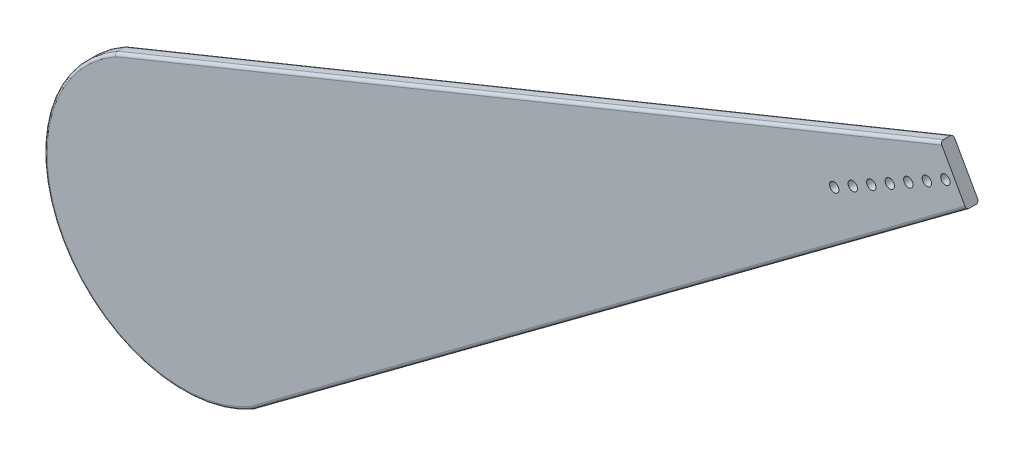
ISO-10303-21;
HEADER;
FILE_DESCRIPTION(('STEP AP214'),'2;1');
FILE_NAME('part.step','',(''),(''),'','','');
FILE_SCHEMA(('AUTOMOTIVE_DESIGN { 1 0 10303 214 1 1 1 1 }'));
ENDSEC;
DATA;
#1=APPLICATION_CONTEXT('core data for automotive mechanical design processes');
#2=APPLICATION_PROTOCOL_DEFINITION('international standard','automotive_design',2000,#1);
#3=PRODUCT_CONTEXT('',#1,'mechanical');
#4=PRODUCT('Part','Part','',(#3));
#5=PRODUCT_RELATED_PRODUCT_CATEGORY('part','',(#4));
#6=PRODUCT_DEFINITION_FORMATION('','',#4);
#7=PRODUCT_DEFINITION_CONTEXT('part definition',#1,'design');
#8=PRODUCT_DEFINITION('design','',#6,#7);
#9=PRODUCT_DEFINITION_SHAPE('','',#8);
#10=(LENGTH_UNIT() NAMED_UNIT(*) SI_UNIT(.MILLI.,.METRE.));
#11=(NAMED_UNIT(*) PLANE_ANGLE_UNIT() SI_UNIT($,.RADIAN.));
#12=(NAMED_UNIT(*) SI_UNIT($,.STERADIAN.) SOLID_ANGLE_UNIT());
#13=UNCERTAINTY_MEASURE_WITH_UNIT(LENGTH_MEASURE(1.E-05),#10,'distance_accuracy_value','');
#14=(GEOMETRIC_REPRESENTATION_CONTEXT(3) GLOBAL_UNCERTAINTY_ASSIGNED_CONTEXT((#13)) GLOBAL_UNIT_ASSIGNED_CONTEXT((#10,
#11,#12)) REPRESENTATION_CONTEXT('',''));
#15=CARTESIAN_POINT('',(0.,0.,0.));
#16=DIRECTION('',(0.,0.,1.));
#17=DIRECTION('',(1.,0.,0.));
#18=AXIS2_PLACEMENT_3D('',#15,#16,#17);
#19=CARTESIAN_POINT('',(-4.99999999999996,3.66025403784442,3.));
#20=DIRECTION('',(0.377162887212808,-0.926146941100222,0.));
#21=DIRECTION('',(0.926146941100222,0.377162887212808,0.));
#22=AXIS2_PLACEMENT_3D('',#19,#20,#21);
#23=PLANE('',#22);
#24=DIRECTION('',(-0.926146941100222,-0.377162887212808,0.));
#25=VECTOR('',#24,1.);
#26=CARTESIAN_POINT('',(-4.99999999999996,3.66025403784442,2.3));
#27=LINE('',#26,#25);
#28=CARTESIAN_POINT('',(-208.752327042049,-79.3155811489734,2.3));
#29=VERTEX_POINT('',#28);
#30=CARTESIAN_POINT('',(-14.2634471787925,-0.112180257890787,2.3));
#31=VERTEX_POINT('',#30);
#32=EDGE_CURVE('E136',#29,#31,#27,.F.);
#33=ORIENTED_EDGE('',*,*,#32,.T.);
#34=DIRECTION('',(0.,0.,-1.));
#35=VECTOR('',#34,1.);
#36=CARTESIAN_POINT('',(-14.2634471787925,-0.112180257890787,3.));
#37=LINE('',#36,#35);
#38=CARTESIAN_POINT('',(-14.2634471787925,-0.112180257890787,0.7));
#39=VERTEX_POINT('',#38);
#40=EDGE_CURVE('E113',#31,#39,#37,.T.);
#41=ORIENTED_EDGE('',*,*,#40,.T.);
#42=DIRECTION('',(-0.926146941100222,-0.377162887212808,0.));
#43=VECTOR('',#42,1.);
#44=CARTESIAN_POINT('',(-4.99999999999996,3.66025403784442,0.7));
#45=LINE('',#44,#43);
#46=CARTESIAN_POINT('',(-208.752327042049,-79.3155811489734,0.7));
#47=VERTEX_POINT('',#46);
#48=EDGE_CURVE('E131',#39,#47,#45,.T.);
#49=ORIENTED_EDGE('',*,*,#48,.T.);
#50=DIRECTION('',(0.,0.,-1.));
#51=VECTOR('',#50,1.);
#52=CARTESIAN_POINT('',(-208.752327042049,-79.3155811489734,3.));
#53=LINE('',#52,#51);
#54=EDGE_CURVE('E221',#29,#47,#53,.T.);
#55=ORIENTED_EDGE('',*,*,#54,.F.);
#56=EDGE_LOOP('',(#33,#41,#49,#55));
#57=FACE_BOUND('',#56,.T.);
#58=ADVANCED_FACE('F45',(#57),#23,.F.);
#59=CARTESIAN_POINT('',(-192.684144602412,-107.745140553955,3.));
#60=DIRECTION('',(0.,0.,-1.));
#61=DIRECTION('',(-1.,0.,0.));
#62=AXIS2_PLACEMENT_3D('',#59,#60,#61);
#63=CYLINDRICAL_SURFACE('',#62,32.6561837157195);
#64=ORIENTED_EDGE('',*,*,#54,.T.);
#65=CARTESIAN_POINT('',(-192.684144602412,-107.745140553955,0.7));
#66=DIRECTION('',(0.,0.,1.));
#67=DIRECTION('',(1.,0.,0.));
#68=AXIS2_PLACEMENT_3D('',#65,#66,#67);
#69=CIRCLE('',#68,32.6561837157195);
#70=CARTESIAN_POINT('',(-176.615962162776,-136.174699958937,0.7));
#71=VERTEX_POINT('',#70);
#72=EDGE_CURVE('E215',#47,#71,#69,.T.);
#73=ORIENTED_EDGE('',*,*,#72,.T.);
#74=DIRECTION('',(0.,0.,-1.));
#75=VECTOR('',#74,1.);
#76=CARTESIAN_POINT('',(-176.615962162776,-136.174699958937,3.));
#77=LINE('',#76,#75);
#78=CARTESIAN_POINT('',(-176.615962162776,-136.174699958937,2.3));
#79=VERTEX_POINT('',#78);
#80=EDGE_CURVE('E225',#79,#71,#77,.T.);
#81=ORIENTED_EDGE('',*,*,#80,.F.);
#82=CARTESIAN_POINT('',(-192.684144602412,-107.745140553955,2.3));
#83=DIRECTION('',(0.,0.,1.));
#84=DIRECTION('',(1.,0.,0.));
#85=AXIS2_PLACEMENT_3D('',#82,#83,#84);
#86=CIRCLE('',#85,32.6561837157195);
#87=EDGE_CURVE('E199',#79,#29,#86,.F.);
#88=ORIENTED_EDGE('',*,*,#87,.T.);
#89=EDGE_LOOP('',(#64,#73,#81,#88));
#90=FACE_BOUND('',#89,.T.);
#91=ADVANCED_FACE('F320',(#90),#63,.T.);
#92=CARTESIAN_POINT('',(0.,-5.,3.));
#93=DIRECTION('',(-0.596248636176985,0.802799828012616,0.));
#94=DIRECTION('',(-0.802799828012616,-0.596248636176985,0.));
#95=AXIS2_PLACEMENT_3D('',#92,#93,#94);
#96=PLANE('',#95);
#97=DIRECTION('',(0.802799828012616,0.596248636176985,0.));
#98=VECTOR('',#97,1.);
#99=CARTESIAN_POINT('',(0.,-5.,0.7));
#100=LINE('',#99,#98);
#101=CARTESIAN_POINT('',(-8.1408503695447,-11.0463029024038,0.7));
#102=VERTEX_POINT('',#101);
#103=EDGE_CURVE('E55',#71,#102,#100,.T.);
#104=ORIENTED_EDGE('',*,*,#103,.T.);
#105=DIRECTION('',(0.,0.,1.));
#106=VECTOR('',#105,1.);
#107=CARTESIAN_POINT('',(-8.1408503695447,-11.0463029024038,3.));
#108=LINE('',#107,#106);
#109=CARTESIAN_POINT('',(-8.1408503695447,-11.0463029024038,2.3));
#110=VERTEX_POINT('',#109);
#111=EDGE_CURVE('E126',#102,#110,#108,.T.);
#112=ORIENTED_EDGE('',*,*,#111,.T.);
#113=DIRECTION('',(0.802799828012616,0.596248636176985,0.));
#114=VECTOR('',#113,1.);
#115=CARTESIAN_POINT('',(-176.615962162776,-136.174699958937,2.3));
#116=LINE('',#115,#114);
#117=EDGE_CURVE('E143',#110,#79,#116,.F.);
#118=ORIENTED_EDGE('',*,*,#117,.T.);
#119=ORIENTED_EDGE('',*,*,#80,.T.);
#120=EDGE_LOOP('',(#104,#112,#118,#119));
#121=FACE_BOUND('',#120,.T.);
#122=ADVANCED_FACE('F300',(#121),#96,.F.);
#123=CARTESIAN_POINT('',(0.,-5.,3.));
#124=DIRECTION('',(0.,0.,1.));
#125=DIRECTION('',(1.,0.,0.));
#126=AXIS2_PLACEMENT_3D('',#123,#124,#125);
#127=PLANE('',#126);
#128=DIRECTION('',(0.488572273581651,-0.872523428617969,0.));
#129=VECTOR('',#128,1.);
#130=CARTESIAN_POINT('',(-10.9065428577246,-6.10715341977064,3.));
#131=LINE('',#130,#129);
#132=CARTESIAN_POINT('',(-13.9188122786738,-0.727651173725995,3.));
#133=VERTEX_POINT('',#132);
#134=CARTESIAN_POINT('',(-8.48568821434414,-10.4304695550549,3.));
#135=VERTEX_POINT('',#134);
#136=EDGE_CURVE('E61',#133,#135,#131,.T.);
#137=ORIENTED_EDGE('',*,*,#136,.F.);
#138=DIRECTION('',(-0.926146941100222,-0.377162887212808,0.));
#139=VECTOR('',#138,1.);
#140=CARTESIAN_POINT('',(-208.488313021,-79.9638840077436,3.));
#141=LINE('',#140,#139);
#142=CARTESIAN_POINT('',(-208.446636530336,-79.9469117273742,3.));
#143=VERTEX_POINT('',#142);
#144=EDGE_CURVE('E68',#133,#143,#141,.T.);
#145=ORIENTED_EDGE('',*,*,#144,.T.);
#146=CARTESIAN_POINT('',(-192.684144602412,-107.745140553955,3.));
#147=DIRECTION('',(0.,0.,1.));
#148=DIRECTION('',(1.,0.,0.));
#149=AXIS2_PLACEMENT_3D('',#146,#147,#148);
#150=CIRCLE('',#149,31.9561837157195);
#151=CARTESIAN_POINT('',(-176.998150387385,-135.586607166886,3.));
#152=VERTEX_POINT('',#151);
#153=EDGE_CURVE('E132',#143,#152,#150,.T.);
#154=ORIENTED_EDGE('',*,*,#153,.T.);
#155=DIRECTION('',(0.802799828012616,0.596248636176985,0.));
#156=VECTOR('',#155,1.);
#157=CARTESIAN_POINT('',(-0.417374045323888,-4.43804012039117,3.));
#158=LINE('',#157,#156);
#159=EDGE_CURVE('E124',#152,#135,#158,.T.);
#160=ORIENTED_EDGE('',*,*,#159,.T.);
#161=EDGE_LOOP('',(#137,#145,#154,#160));
#162=FACE_BOUND('',#161,.T.);
#163=CARTESIAN_POINT('',(-39.2635542878086,-21.9857523111743,3.));
#164=DIRECTION('',(0.,0.,1.));
#165=DIRECTION('',(1.,0.,0.));
#166=AXIS2_PLACEMENT_3D('',#163,#164,#165);
#167=CIRCLE('',#166,1.09999999999999);
#168=CARTESIAN_POINT('',(-38.1635542878086,-21.9857523111743,3.));
#169=VERTEX_POINT('',#168);
#170=EDGE_CURVE('E281',#169,#169,#167,.T.);
#171=ORIENTED_EDGE('',*,*,#170,.F.);
#172=EDGE_LOOP('',(#171));
#173=FACE_BOUND('',#172,.T.);
#174=CARTESIAN_POINT('',(-34.9009371447188,-19.542890943266,3.));
#175=DIRECTION('',(0.,0.,1.));
#176=DIRECTION('',(1.,0.,0.));
#177=AXIS2_PLACEMENT_3D('',#174,#175,#176);
#178=CIRCLE('',#177,1.09999999999999);
#179=CARTESIAN_POINT('',(-33.8009371447188,-19.542890943266,3.));
#180=VERTEX_POINT('',#179);
#181=EDGE_CURVE('E273',#180,#180,#178,.T.);
#182=ORIENTED_EDGE('',*,*,#181,.F.);
#183=EDGE_LOOP('',(#182));
#184=FACE_BOUND('',#183,.T.);
#185=CARTESIAN_POINT('',(-30.5383200016289,-17.1000295753578,3.));
#186=DIRECTION('',(0.,0.,1.));
#187=DIRECTION('',(1.,0.,0.));
#188=AXIS2_PLACEMENT_3D('',#185,#186,#187);
#189=CIRCLE('',#188,1.09999999999999);
#190=CARTESIAN_POINT('',(-29.4383200016289,-17.1000295753578,3.));
#191=VERTEX_POINT('',#190);
#192=EDGE_CURVE('E265',#191,#191,#189,.T.);
#193=ORIENTED_EDGE('',*,*,#192,.F.);
#194=EDGE_LOOP('',(#193));
#195=FACE_BOUND('',#194,.T.);
#196=CARTESIAN_POINT('',(-26.1757028585391,-14.6571682074495,3.));
#197=DIRECTION('',(0.,0.,1.));
#198=DIRECTION('',(1.,0.,0.));
#199=AXIS2_PLACEMENT_3D('',#196,#197,#198);
#200=CIRCLE('',#199,1.09999999999999);
#201=CARTESIAN_POINT('',(-25.0757028585391,-14.6571682074495,3.));
#202=VERTEX_POINT('',#201);
#203=EDGE_CURVE('E257',#202,#202,#200,.T.);
#204=ORIENTED_EDGE('',*,*,#203,.F.);
#205=EDGE_LOOP('',(#204));
#206=FACE_BOUND('',#205,.T.);
#207=CARTESIAN_POINT('',(-21.8130857154492,-12.2143068395413,3.));
#208=DIRECTION('',(0.,0.,1.));
#209=DIRECTION('',(1.,0.,0.));
#210=AXIS2_PLACEMENT_3D('',#207,#208,#209);
#211=CIRCLE('',#210,1.09999999999999);
#212=CARTESIAN_POINT('',(-20.7130857154492,-12.2143068395413,3.));
#213=VERTEX_POINT('',#212);
#214=EDGE_CURVE('E249',#213,#213,#211,.T.);
#215=ORIENTED_EDGE('',*,*,#214,.F.);
#216=EDGE_LOOP('',(#215));
#217=FACE_BOUND('',#216,.T.);
#218=CARTESIAN_POINT('',(-17.4504685723594,-9.77144547163302,3.));
#219=DIRECTION('',(0.,0.,1.));
#220=DIRECTION('',(1.,0.,0.));
#221=AXIS2_PLACEMENT_3D('',#218,#219,#220);
#222=CIRCLE('',#221,1.09999999999999);
#223=CARTESIAN_POINT('',(-16.3504685723594,-9.77144547163302,3.));
#224=VERTEX_POINT('',#223);
#225=EDGE_CURVE('E241',#224,#224,#222,.T.);
#226=ORIENTED_EDGE('',*,*,#225,.F.);
#227=EDGE_LOOP('',(#226));
#228=FACE_BOUND('',#227,.T.);
#229=CARTESIAN_POINT('',(-13.0878514292695,-7.32858410372477,3.));
#230=DIRECTION('',(0.,0.,1.));
#231=DIRECTION('',(1.,0.,0.));
#232=AXIS2_PLACEMENT_3D('',#229,#230,#231);
#233=CIRCLE('',#232,1.09999999999999);
#234=CARTESIAN_POINT('',(-11.9878514292695,-7.32858410372477,3.));
#235=VERTEX_POINT('',#234);
#236=EDGE_CURVE('E233',#235,#235,#233,.T.);
#237=ORIENTED_EDGE('',*,*,#236,.F.);
#238=EDGE_LOOP('',(#237));
#239=FACE_BOUND('',#238,.T.);
#240=ADVANCED_FACE('F121',(#162,#173,#184,#195,#206,#217,#228,#239),#127,.T.);
#241=CARTESIAN_POINT('',(0.,-5.,0.));
#242=DIRECTION('',(0.,0.,1.));
#243=DIRECTION('',(1.,0.,0.));
#244=AXIS2_PLACEMENT_3D('',#241,#242,#243);
#245=PLANE('',#244);
#246=DIRECTION('',(-0.926146941100222,-0.377162887212808,0.));
#247=VECTOR('',#246,1.);
#248=CARTESIAN_POINT('',(-3.47234341606038,3.52655534853645,0.));
#249=LINE('',#248,#247);
#250=CARTESIAN_POINT('',(-208.446636530336,-79.9469117273741,0.));
#251=VERTEX_POINT('',#250);
#252=CARTESIAN_POINT('',(-13.9188122786738,-0.727651173725995,0.));
#253=VERTEX_POINT('',#252);
#254=EDGE_CURVE('E203',#251,#253,#249,.F.);
#255=ORIENTED_EDGE('',*,*,#254,.T.);
#256=DIRECTION('',(0.488572273581651,-0.872523428617969,0.));
#257=VECTOR('',#256,1.);
#258=CARTESIAN_POINT('',(-8.77508908135892,-9.91363908720692,0.));
#259=LINE('',#258,#257);
#260=CARTESIAN_POINT('',(-8.48568821434414,-10.4304695550549,0.));
#261=VERTEX_POINT('',#260);
#262=EDGE_CURVE('E290',#253,#261,#259,.T.);
#263=ORIENTED_EDGE('',*,*,#262,.T.);
#264=DIRECTION('',(0.802799828012616,0.596248636176985,0.));
#265=VECTOR('',#264,1.);
#266=CARTESIAN_POINT('',(-0.417374045323892,-4.43804012039117,0.));
#267=LINE('',#266,#265);
#268=CARTESIAN_POINT('',(-176.998150387385,-135.586607166886,0.));
#269=VERTEX_POINT('',#268);
#270=EDGE_CURVE('E212',#261,#269,#267,.F.);
#271=ORIENTED_EDGE('',*,*,#270,.T.);
#272=CARTESIAN_POINT('',(-192.684144602412,-107.745140553955,0.));
#273=DIRECTION('',(0.,0.,1.));
#274=DIRECTION('',(1.,0.,0.));
#275=AXIS2_PLACEMENT_3D('',#272,#273,#274);
#276=CIRCLE('',#275,31.9561837157195);
#277=EDGE_CURVE('E206',#269,#251,#276,.F.);
#278=ORIENTED_EDGE('',*,*,#277,.T.);
#279=EDGE_LOOP('',(#255,#263,#271,#278));
#280=FACE_BOUND('',#279,.T.);
#281=CARTESIAN_POINT('',(-39.2635542878086,-21.9857523111743,0.));
#282=DIRECTION('',(0.,0.,1.));
#283=DIRECTION('',(1.,0.,0.));
#284=AXIS2_PLACEMENT_3D('',#281,#282,#283);
#285=CIRCLE('',#284,1.09999999999999);
#286=CARTESIAN_POINT('',(-38.1635542878086,-21.9857523111743,0.));
#287=VERTEX_POINT('',#286);
#288=EDGE_CURVE('E277',#287,#287,#285,.T.);
#289=ORIENTED_EDGE('',*,*,#288,.T.);
#290=EDGE_LOOP('',(#289));
#291=FACE_BOUND('',#290,.T.);
#292=CARTESIAN_POINT('',(-34.9009371447188,-19.542890943266,0.));
#293=DIRECTION('',(0.,0.,1.));
#294=DIRECTION('',(1.,0.,0.));
#295=AXIS2_PLACEMENT_3D('',#292,#293,#294);
#296=CIRCLE('',#295,1.09999999999999);
#297=CARTESIAN_POINT('',(-33.8009371447188,-19.542890943266,0.));
#298=VERTEX_POINT('',#297);
#299=EDGE_CURVE('E269',#298,#298,#296,.T.);
#300=ORIENTED_EDGE('',*,*,#299,.T.);
#301=EDGE_LOOP('',(#300));
#302=FACE_BOUND('',#301,.T.);
#303=CARTESIAN_POINT('',(-30.5383200016289,-17.1000295753578,0.));
#304=DIRECTION('',(0.,0.,1.));
#305=DIRECTION('',(1.,0.,0.));
#306=AXIS2_PLACEMENT_3D('',#303,#304,#305);
#307=CIRCLE('',#306,1.09999999999999);
#308=CARTESIAN_POINT('',(-29.4383200016289,-17.1000295753578,0.));
#309=VERTEX_POINT('',#308);
#310=EDGE_CURVE('E261',#309,#309,#307,.T.);
#311=ORIENTED_EDGE('',*,*,#310,.T.);
#312=EDGE_LOOP('',(#311));
#313=FACE_BOUND('',#312,.T.);
#314=CARTESIAN_POINT('',(-26.1757028585391,-14.6571682074495,0.));
#315=DIRECTION('',(0.,0.,1.));
#316=DIRECTION('',(1.,0.,0.));
#317=AXIS2_PLACEMENT_3D('',#314,#315,#316);
#318=CIRCLE('',#317,1.09999999999999);
#319=CARTESIAN_POINT('',(-25.0757028585391,-14.6571682074495,0.));
#320=VERTEX_POINT('',#319);
#321=EDGE_CURVE('E253',#320,#320,#318,.T.);
#322=ORIENTED_EDGE('',*,*,#321,.T.);
#323=EDGE_LOOP('',(#322));
#324=FACE_BOUND('',#323,.T.);
#325=CARTESIAN_POINT('',(-21.8130857154492,-12.2143068395413,0.));
#326=DIRECTION('',(0.,0.,1.));
#327=DIRECTION('',(1.,0.,0.));
#328=AXIS2_PLACEMENT_3D('',#325,#326,#327);
#329=CIRCLE('',#328,1.09999999999999);
#330=CARTESIAN_POINT('',(-20.7130857154492,-12.2143068395413,0.));
#331=VERTEX_POINT('',#330);
#332=EDGE_CURVE('E245',#331,#331,#329,.T.);
#333=ORIENTED_EDGE('',*,*,#332,.T.);
#334=EDGE_LOOP('',(#333));
#335=FACE_BOUND('',#334,.T.);
#336=CARTESIAN_POINT('',(-17.4504685723594,-9.77144547163302,0.));
#337=DIRECTION('',(0.,0.,1.));
#338=DIRECTION('',(1.,0.,0.));
#339=AXIS2_PLACEMENT_3D('',#336,#337,#338);
#340=CIRCLE('',#339,1.09999999999999);
#341=CARTESIAN_POINT('',(-16.3504685723594,-9.77144547163302,0.));
#342=VERTEX_POINT('',#341);
#343=EDGE_CURVE('E237',#342,#342,#340,.T.);
#344=ORIENTED_EDGE('',*,*,#343,.T.);
#345=EDGE_LOOP('',(#344));
#346=FACE_BOUND('',#345,.T.);
#347=CARTESIAN_POINT('',(-13.0878514292695,-7.32858410372477,0.));
#348=DIRECTION('',(0.,0.,1.));
#349=DIRECTION('',(1.,0.,0.));
#350=AXIS2_PLACEMENT_3D('',#347,#348,#349);
#351=CIRCLE('',#350,1.09999999999999);
#352=CARTESIAN_POINT('',(-11.9878514292695,-7.32858410372477,0.));
#353=VERTEX_POINT('',#352);
#354=EDGE_CURVE('E229',#353,#353,#351,.T.);
#355=ORIENTED_EDGE('',*,*,#354,.T.);
#356=EDGE_LOOP('',(#355));
#357=FACE_BOUND('',#356,.T.);
#358=ADVANCED_FACE('F309',(#280,#291,#302,#313,#324,#335,#346,#357),#245,.F.);
#359=CARTESIAN_POINT('',(-13.0878514292695,-7.32858410372477,3.));
#360=DIRECTION('',(0.,0.,1.));
#361=DIRECTION('',(1.,0.,0.));
#362=AXIS2_PLACEMENT_3D('',#359,#360,#361);
#363=CYLINDRICAL_SURFACE('',#362,1.09999999999999);
#364=ORIENTED_EDGE('',*,*,#354,.F.);
#365=EDGE_LOOP('',(#364));
#366=FACE_BOUND('',#365,.T.);
#367=ORIENTED_EDGE('',*,*,#236,.T.);
#368=EDGE_LOOP('',(#367));
#369=FACE_BOUND('',#368,.T.);
#370=ADVANCED_FACE('F332',(#366,#369),#363,.F.);
#371=CARTESIAN_POINT('',(-17.4504685723594,-9.77144547163302,3.));
#372=DIRECTION('',(0.,0.,1.));
#373=DIRECTION('',(1.,0.,0.));
#374=AXIS2_PLACEMENT_3D('',#371,#372,#373);
#375=CYLINDRICAL_SURFACE('',#374,1.09999999999999);
#376=ORIENTED_EDGE('',*,*,#343,.F.);
#377=EDGE_LOOP('',(#376));
#378=FACE_BOUND('',#377,.T.);
#379=ORIENTED_EDGE('',*,*,#225,.T.);
#380=EDGE_LOOP('',(#379));
#381=FACE_BOUND('',#380,.T.);
#382=ADVANCED_FACE('F337',(#378,#381),#375,.F.);
#383=CARTESIAN_POINT('',(-21.8130857154492,-12.2143068395413,3.));
#384=DIRECTION('',(0.,0.,1.));
#385=DIRECTION('',(1.,0.,0.));
#386=AXIS2_PLACEMENT_3D('',#383,#384,#385);
#387=CYLINDRICAL_SURFACE('',#386,1.09999999999999);
#388=ORIENTED_EDGE('',*,*,#332,.F.);
#389=EDGE_LOOP('',(#388));
#390=FACE_BOUND('',#389,.T.);
#391=ORIENTED_EDGE('',*,*,#214,.T.);
#392=EDGE_LOOP('',(#391));
#393=FACE_BOUND('',#392,.T.);
#394=ADVANCED_FACE('F341',(#390,#393),#387,.F.);
#395=CARTESIAN_POINT('',(-26.1757028585391,-14.6571682074495,3.));
#396=DIRECTION('',(0.,0.,1.));
#397=DIRECTION('',(1.,0.,0.));
#398=AXIS2_PLACEMENT_3D('',#395,#396,#397);
#399=CYLINDRICAL_SURFACE('',#398,1.09999999999999);
#400=ORIENTED_EDGE('',*,*,#321,.F.);
#401=EDGE_LOOP('',(#400));
#402=FACE_BOUND('',#401,.T.);
#403=ORIENTED_EDGE('',*,*,#203,.T.);
#404=EDGE_LOOP('',(#403));
#405=FACE_BOUND('',#404,.T.);
#406=ADVANCED_FACE('F345',(#402,#405),#399,.F.);
#407=CARTESIAN_POINT('',(-30.5383200016289,-17.1000295753578,3.));
#408=DIRECTION('',(0.,0.,1.));
#409=DIRECTION('',(1.,0.,0.));
#410=AXIS2_PLACEMENT_3D('',#407,#408,#409);
#411=CYLINDRICAL_SURFACE('',#410,1.09999999999999);
#412=ORIENTED_EDGE('',*,*,#310,.F.);
#413=EDGE_LOOP('',(#412));
#414=FACE_BOUND('',#413,.T.);
#415=ORIENTED_EDGE('',*,*,#192,.T.);
#416=EDGE_LOOP('',(#415));
#417=FACE_BOUND('',#416,.T.);
#418=ADVANCED_FACE('F349',(#414,#417),#411,.F.);
#419=CARTESIAN_POINT('',(-34.9009371447188,-19.542890943266,3.));
#420=DIRECTION('',(0.,0.,1.));
#421=DIRECTION('',(1.,0.,0.));
#422=AXIS2_PLACEMENT_3D('',#419,#420,#421);
#423=CYLINDRICAL_SURFACE('',#422,1.09999999999999);
#424=ORIENTED_EDGE('',*,*,#299,.F.);
#425=EDGE_LOOP('',(#424));
#426=FACE_BOUND('',#425,.T.);
#427=ORIENTED_EDGE('',*,*,#181,.T.);
#428=EDGE_LOOP('',(#427));
#429=FACE_BOUND('',#428,.T.);
#430=ADVANCED_FACE('F353',(#426,#429),#423,.F.);
#431=CARTESIAN_POINT('',(-39.2635542878086,-21.9857523111743,3.));
#432=DIRECTION('',(0.,0.,1.));
#433=DIRECTION('',(1.,0.,0.));
#434=AXIS2_PLACEMENT_3D('',#431,#432,#433);
#435=CYLINDRICAL_SURFACE('',#434,1.09999999999999);
#436=ORIENTED_EDGE('',*,*,#288,.F.);
#437=EDGE_LOOP('',(#436));
#438=FACE_BOUND('',#437,.T.);
#439=ORIENTED_EDGE('',*,*,#170,.T.);
#440=EDGE_LOOP('',(#439));
#441=FACE_BOUND('',#440,.T.);
#442=ADVANCED_FACE('F177',(#438,#441),#435,.F.);
#443=CARTESIAN_POINT('',(-4.73598597895099,3.01195117907427,0.7));
#444=DIRECTION('',(-0.926146941100222,-0.377162887212808,0.));
#445=DIRECTION('',(0.377162887212808,-0.926146941100222,0.));
#446=AXIS2_PLACEMENT_3D('',#443,#444,#445);
#447=CYLINDRICAL_SURFACE('',#446,0.7);
#448=CARTESIAN_POINT('',(-13.9188122786738,-0.727651173725994,0.7));
#449=DIRECTION('',(-0.872523428617969,-0.488572273581651,0.));
#450=DIRECTION('',(-0.488572273581651,0.872523428617969,0.));
#451=AXIS2_PLACEMENT_3D('',#448,#449,#450);
#452=ELLIPSE('',#451,0.70539185040576,0.7);
#453=EDGE_CURVE('E287',#253,#39,#452,.F.);
#454=ORIENTED_EDGE('',*,*,#453,.F.);
#455=ORIENTED_EDGE('',*,*,#254,.F.);
#456=CARTESIAN_POINT('',(-208.752327042049,-79.3155811489734,0.7));
#457=CARTESIAN_POINT('',(-208.752341695203,-79.3155507111608,0.660678877179086));
#458=CARTESIAN_POINT('',(-208.750882127115,-79.3185679094294,0.621368212379049));
#459=CARTESIAN_POINT('',(-208.74512271286,-79.3304728957017,0.543889348580937));
#460=CARTESIAN_POINT('',(-208.740825064485,-79.339356141076,0.505720289419379));
#461=CARTESIAN_POINT('',(-208.729494752189,-79.3627745401859,0.431564997581965));
#462=CARTESIAN_POINT('',(-208.722460835942,-79.3773122818514,0.395579773126294));
#463=CARTESIAN_POINT('',(-208.705865302617,-79.4116091677911,0.326835738624374));
#464=CARTESIAN_POINT('',(-208.696304251495,-79.4313671429838,0.294076208429613));
#465=CARTESIAN_POINT('',(-208.674915575979,-79.4755624314384,0.232672607995611));
#466=CARTESIAN_POINT('',(-208.663086053654,-79.5000036629608,0.204032019256086));
#467=CARTESIAN_POINT('',(-208.637496600431,-79.552868220131,0.151695176662847));
#468=CARTESIAN_POINT('',(-208.623735985963,-79.5812929558603,0.128000681054236));
#469=CARTESIAN_POINT('',(-208.594647014183,-79.6413727802425,0.0861867785621484));
#470=CARTESIAN_POINT('',(-208.57931522779,-79.6730349342053,0.0680799274046772));
#471=CARTESIAN_POINT('',(-208.547549106089,-79.7386266179619,0.0380327804928994));
#472=CARTESIAN_POINT('',(-208.531115810769,-79.7725540089199,0.0260867581430442));
#473=CARTESIAN_POINT('',(-208.504310237496,-79.827887157878,0.0121484793841041));
#474=CARTESIAN_POINT('',(-208.494134112068,-79.8488912776816,0.0080865911750149));
#475=CARTESIAN_POINT('',(-208.473663272037,-79.8911404438025,0.00233952327914135));
#476=CARTESIAN_POINT('',(-208.463368753029,-79.9123850920385,0.000650870085869237));
#477=CARTESIAN_POINT('',(-208.450924391831,-79.9380639916437,5.14668721393049E-05));
#478=CARTESIAN_POINT('',(-208.448780318648,-79.9424881957286,-1.38091442617454E-07));
#479=CARTESIAN_POINT('',(-208.446636530336,-79.9469117273747,0.));
#480=B_SPLINE_CURVE_WITH_KNOTS('',3,(#456,#457,#458,#459,#460,#461,#462,#463,#464,#465,#466,
#467,#468,#469,#470,#471,#472,#473,#474,#475,#476,#477,#478,#479),.UNSPECIFIED.,.F.,.F.,(4,2,2,
2,2,2,2,2,2,2,2,4),(0.,0.117805709317535,0.235520297460631,0.353288824317571,0.471030999004601,
0.588872116593268,0.706755053460866,0.824900982325654,0.942936893697377,1.01390492030328,
1.08476896835987,1.09951761831528),.UNSPECIFIED.);
#481=EDGE_CURVE('E158',#47,#251,#480,.T.);
#482=ORIENTED_EDGE('',*,*,#481,.F.);
#483=ORIENTED_EDGE('',*,*,#48,.F.);
#484=EDGE_LOOP('',(#454,#455,#482,#483));
#485=FACE_BOUND('',#484,.T.);
#486=ADVANCED_FACE('F172',(#485),#447,.T.);
#487=CARTESIAN_POINT('',(-0.417374045323888,-4.43804012039117,0.7));
#488=DIRECTION('',(0.802799828012616,0.596248636176985,0.));
#489=DIRECTION('',(-0.596248636176985,0.802799828012616,0.));
#490=AXIS2_PLACEMENT_3D('',#487,#488,#489);
#491=CYLINDRICAL_SURFACE('',#490,0.7);
#492=CARTESIAN_POINT('',(-8.48568821434414,-10.4304695550549,0.7));
#493=DIRECTION('',(-0.872523428617969,-0.488572273581651,0.));
#494=DIRECTION('',(-0.488572273581651,0.872523428617969,0.));
#495=AXIS2_PLACEMENT_3D('',#492,#493,#494);
#496=ELLIPSE('',#495,0.705807233536793,0.7);
#497=EDGE_CURVE('E294',#102,#261,#496,.F.);
#498=ORIENTED_EDGE('',*,*,#497,.F.);
#499=ORIENTED_EDGE('',*,*,#103,.F.);
#500=CARTESIAN_POINT('',(-176.615962162776,-136.174699958937,0.7));
#501=CARTESIAN_POINT('',(-176.615943701775,-136.174728229319,0.660675892819586));
#502=CARTESIAN_POINT('',(-176.617771168497,-136.171918400507,0.621362219423709));
#503=CARTESIAN_POINT('',(-176.624981699855,-136.160831202374,0.543877261295604));
#504=CARTESIAN_POINT('',(-176.630362024126,-136.152558046989,0.505705119785737));
#505=CARTESIAN_POINT('',(-176.644545654204,-136.130747256922,0.431543766788787));
#506=CARTESIAN_POINT('',(-176.653350530989,-136.117207206108,0.395555565933204));
#507=CARTESIAN_POINT('',(-176.674122150878,-136.085262588263,0.326806012929561));
#508=CARTESIAN_POINT('',(-176.68608818275,-136.066859115458,0.294043937206114));
#509=CARTESIAN_POINT('',(-176.712852714881,-136.025692358115,0.232637440143932));
#510=CARTESIAN_POINT('',(-176.727653457149,-136.002925622608,0.203996309726449));
#511=CARTESIAN_POINT('',(-176.759664988666,-135.953680023272,0.15165913749586));
#512=CARTESIAN_POINT('',(-176.776876632965,-135.92719984243,0.127964857589452));
#513=CARTESIAN_POINT('',(-176.813252344162,-135.871229386243,0.0861546526041597));
#514=CARTESIAN_POINT('',(-176.832420498647,-135.841732808719,0.0680507381218182));
#515=CARTESIAN_POINT('',(-176.872127006471,-135.780623720992,0.0380099268478104));
#516=CARTESIAN_POINT('',(-176.892664059944,-135.749013218016,0.0260672711239642));
#517=CARTESIAN_POINT('',(-176.926132117658,-135.69749289385,0.0121448744327898));
#518=CARTESIAN_POINT('',(-176.938820365828,-135.677959321173,0.00809082744884139));
#519=CARTESIAN_POINT('',(-176.964341352699,-135.638666744022,0.00235043692465924));
#520=CARTESIAN_POINT('',(-176.977173853234,-135.618908110571,0.000660643052637715));
#521=CARTESIAN_POINT('',(-176.99272506209,-135.594961562934,5.28425366923219E-05));
#522=CARTESIAN_POINT('',(-176.995437943411,-135.590784062056,-1.41868236332401E-07));
#523=CARTESIAN_POINT('',(-176.998150387385,-135.586607166886,0.));
#524=B_SPLINE_CURVE_WITH_KNOTS('',3,(#500,#501,#502,#503,#504,#505,#506,#507,#508,#509,#510,
#511,#512,#513,#514,#515,#516,#517,#518,#519,#520,#521,#522,#523),.UNSPECIFIED.,.F.,.F.,(4,2,2,
2,2,2,2,2,2,2,2,4),(0.,0.11781470053849,0.235538635029456,0.35331663795155,0.471068164434966,
0.588913209613939,0.706800156016836,0.824938641709374,0.94296650230932,1.0137932903167,
1.08451660728637,1.09945941349294),.UNSPECIFIED.);
#525=EDGE_CURVE('E149',#269,#71,#524,.F.);
#526=ORIENTED_EDGE('',*,*,#525,.F.);
#527=ORIENTED_EDGE('',*,*,#270,.F.);
#528=EDGE_LOOP('',(#498,#499,#526,#527));
#529=FACE_BOUND('',#528,.T.);
#530=ADVANCED_FACE('F165',(#529),#491,.T.);
#531=CARTESIAN_POINT('',(-192.684144602412,-107.745140553955,0.7));
#532=DIRECTION('',(0.,0.,1.));
#533=DIRECTION('',(1.,0.,0.));
#534=AXIS2_PLACEMENT_3D('',#531,#532,#533);
#535=TOROIDAL_SURFACE('',#534,31.9561837157195,0.7);
#536=ORIENTED_EDGE('',*,*,#481,.T.);
#537=ORIENTED_EDGE('',*,*,#277,.F.);
#538=ORIENTED_EDGE('',*,*,#525,.T.);
#539=ORIENTED_EDGE('',*,*,#72,.F.);
#540=EDGE_LOOP('',(#536,#537,#538,#539));
#541=FACE_BOUND('',#540,.T.);
#542=ADVANCED_FACE('F168',(#541),#535,.T.);
#543=CARTESIAN_POINT('',(-3.47234341606038,3.52655534853645,2.3));
#544=DIRECTION('',(0.926146941100222,0.377162887212808,0.));
#545=DIRECTION('',(-0.377162887212808,0.926146941100222,0.));
#546=AXIS2_PLACEMENT_3D('',#543,#544,#545);
#547=CYLINDRICAL_SURFACE('',#546,0.7);
#548=CARTESIAN_POINT('',(-13.9188122786738,-0.727651173725994,2.3));
#549=DIRECTION('',(-0.872523428617969,-0.488572273581651,0.));
#550=DIRECTION('',(0.488572273581651,-0.872523428617969,0.));
#551=AXIS2_PLACEMENT_3D('',#548,#549,#550);
#552=ELLIPSE('',#551,0.70539185040576,0.7);
#553=EDGE_CURVE('E110',#31,#133,#552,.F.);
#554=ORIENTED_EDGE('',*,*,#553,.F.);
#555=ORIENTED_EDGE('',*,*,#32,.F.);
#556=CARTESIAN_POINT('',(-208.752327042049,-79.3155811489734,2.3));
#557=CARTESIAN_POINT('',(-208.752341695203,-79.3155507111608,2.33932112282091));
#558=CARTESIAN_POINT('',(-208.750882127115,-79.3185679094294,2.37863178762095));
#559=CARTESIAN_POINT('',(-208.74512271286,-79.3304728957017,2.45611065141906));
#560=CARTESIAN_POINT('',(-208.740825064485,-79.3393561410761,2.49427971058062));
#561=CARTESIAN_POINT('',(-208.729494752189,-79.3627745401859,2.56843500241804));
#562=CARTESIAN_POINT('',(-208.722460835942,-79.3773122818514,2.60442022687371));
#563=CARTESIAN_POINT('',(-208.705865302617,-79.4116091677911,2.67316426137563));
#564=CARTESIAN_POINT('',(-208.696304251495,-79.4313671429838,2.70592379157039));
#565=CARTESIAN_POINT('',(-208.674915575979,-79.4755624314384,2.76732739200439));
#566=CARTESIAN_POINT('',(-208.663086053654,-79.5000036629608,2.79596798074392));
#567=CARTESIAN_POINT('',(-208.637496600431,-79.552868220131,2.84830482333716));
#568=CARTESIAN_POINT('',(-208.623735985963,-79.5812929558603,2.87199931894577));
#569=CARTESIAN_POINT('',(-208.594647014183,-79.6413727802425,2.91381322143785));
#570=CARTESIAN_POINT('',(-208.57931522779,-79.6730349342054,2.93192007259532));
#571=CARTESIAN_POINT('',(-208.547549106089,-79.7386266179619,2.9619672195071));
#572=CARTESIAN_POINT('',(-208.531115810769,-79.7725540089199,2.97391324185695));
#573=CARTESIAN_POINT('',(-208.504310237496,-79.827887157878,2.9878515206159));
#574=CARTESIAN_POINT('',(-208.494134112068,-79.8488912776816,2.99191340882499));
#575=CARTESIAN_POINT('',(-208.473663272037,-79.8911404438025,2.99766047672086));
#576=CARTESIAN_POINT('',(-208.463368753029,-79.9123850920385,2.99934912991413));
#577=CARTESIAN_POINT('',(-208.450924391831,-79.9380639916437,2.99994853312786));
#578=CARTESIAN_POINT('',(-208.448780318648,-79.9424881957286,3.00000013809144));
#579=CARTESIAN_POINT('',(-208.446636530336,-79.9469117273747,3.));
#580=B_SPLINE_CURVE_WITH_KNOTS('',3,(#556,#557,#558,#559,#560,#561,#562,#563,#564,#565,#566,
#567,#568,#569,#570,#571,#572,#573,#574,#575,#576,#577,#578,#579),.UNSPECIFIED.,.F.,.F.,(4,2,2,
2,2,2,2,2,2,2,2,4),(0.,0.117805709317535,0.235520297460634,0.353288824317572,0.471030999004609,
0.588872116593266,0.706755053460876,0.824900982325649,0.942936893697371,1.01390492030329,
1.0847689683599,1.09951761831528),.UNSPECIFIED.);
#581=EDGE_CURVE('E128',#143,#29,#580,.F.);
#582=ORIENTED_EDGE('',*,*,#581,.F.);
#583=ORIENTED_EDGE('',*,*,#144,.F.);
#584=EDGE_LOOP('',(#554,#555,#582,#583));
#585=FACE_BOUND('',#584,.T.);
#586=ADVANCED_FACE('F47',(#585),#547,.T.);
#587=CARTESIAN_POINT('',(-0.417374045323888,-4.43804012039117,2.3));
#588=DIRECTION('',(-0.802799828012616,-0.596248636176985,0.));
#589=DIRECTION('',(0.596248636176985,-0.802799828012616,0.));
#590=AXIS2_PLACEMENT_3D('',#587,#588,#589);
#591=CYLINDRICAL_SURFACE('',#590,0.7);
#592=CARTESIAN_POINT('',(-8.48568821434414,-10.4304695550549,2.3));
#593=DIRECTION('',(-0.872523428617969,-0.488572273581651,0.));
#594=DIRECTION('',(0.488572273581651,-0.872523428617969,0.));
#595=AXIS2_PLACEMENT_3D('',#592,#593,#594);
#596=ELLIPSE('',#595,0.705807233536793,0.7);
#597=EDGE_CURVE('E11',#135,#110,#596,.F.);
#598=ORIENTED_EDGE('',*,*,#597,.F.);
#599=ORIENTED_EDGE('',*,*,#159,.F.);
#600=CARTESIAN_POINT('',(-176.615962162776,-136.174699958937,2.3));
#601=CARTESIAN_POINT('',(-176.615943701774,-136.174728229319,2.33932410718042));
#602=CARTESIAN_POINT('',(-176.617771168497,-136.171918400507,2.37863778057629));
#603=CARTESIAN_POINT('',(-176.624981699855,-136.160831202374,2.45612273870439));
#604=CARTESIAN_POINT('',(-176.630362024126,-136.152558046989,2.49429488021426));
#605=CARTESIAN_POINT('',(-176.644545654204,-136.130747256922,2.56845623321122));
#606=CARTESIAN_POINT('',(-176.653350530989,-136.117207206108,2.60444443406681));
#607=CARTESIAN_POINT('',(-176.674122150878,-136.085262588263,2.67319398707045));
#608=CARTESIAN_POINT('',(-176.68608818275,-136.066859115458,2.70595606279389));
#609=CARTESIAN_POINT('',(-176.712852714882,-136.025692358115,2.76736255985606));
#610=CARTESIAN_POINT('',(-176.727653457149,-136.002925622608,2.79600369027354));
#611=CARTESIAN_POINT('',(-176.759664988666,-135.953680023272,2.84834086250414));
#612=CARTESIAN_POINT('',(-176.776876632965,-135.92719984243,2.87203514241055));
#613=CARTESIAN_POINT('',(-176.813252344162,-135.871229386243,2.91384534739584));
#614=CARTESIAN_POINT('',(-176.832420498647,-135.841732808719,2.93194926187817));
#615=CARTESIAN_POINT('',(-176.87212700647,-135.780623720992,2.96199007315218));
#616=CARTESIAN_POINT('',(-176.892664059944,-135.749013218016,2.97393272887603));
#617=CARTESIAN_POINT('',(-176.926132117658,-135.69749289385,2.98785512556721));
#618=CARTESIAN_POINT('',(-176.938820365828,-135.677959321173,2.99190917255116));
#619=CARTESIAN_POINT('',(-176.964341352699,-135.638666744022,2.99764956307534));
#620=CARTESIAN_POINT('',(-176.977173853234,-135.618908110571,2.99933935694736));
#621=CARTESIAN_POINT('',(-176.99272506209,-135.594961562934,2.99994715746331));
#622=CARTESIAN_POINT('',(-176.995437943412,-135.590784062056,3.00000014186824));
#623=CARTESIAN_POINT('',(-176.998150387385,-135.586607166886,3.));
#624=B_SPLINE_CURVE_WITH_KNOTS('',3,(#600,#601,#602,#603,#604,#605,#606,#607,#608,#609,#610,
#611,#612,#613,#614,#615,#616,#617,#618,#619,#620,#621,#622,#623),.UNSPECIFIED.,.F.,.F.,(4,2,2,
2,2,2,2,2,2,2,2,4),(0.,0.11781470053849,0.235538635029456,0.353316637951551,0.47106816443497,
0.588913209613919,0.70680015601684,0.824938641709368,0.942966502309324,1.01379329031671,
1.08451660728639,1.099459413493),.UNSPECIFIED.);
#625=EDGE_CURVE('E118',#79,#152,#624,.T.);
#626=ORIENTED_EDGE('',*,*,#625,.F.);
#627=ORIENTED_EDGE('',*,*,#117,.F.);
#628=EDGE_LOOP('',(#598,#599,#626,#627));
#629=FACE_BOUND('',#628,.T.);
#630=ADVANCED_FACE('F182',(#629),#591,.T.);
#631=CARTESIAN_POINT('',(-192.684144602412,-107.745140553955,2.3));
#632=DIRECTION('',(0.,0.,1.));
#633=DIRECTION('',(1.,0.,0.));
#634=AXIS2_PLACEMENT_3D('',#631,#632,#633);
#635=TOROIDAL_SURFACE('',#634,31.9561837157195,0.7);
#636=ORIENTED_EDGE('',*,*,#581,.T.);
#637=ORIENTED_EDGE('',*,*,#87,.F.);
#638=ORIENTED_EDGE('',*,*,#625,.T.);
#639=ORIENTED_EDGE('',*,*,#153,.F.);
#640=EDGE_LOOP('',(#636,#637,#638,#639));
#641=FACE_BOUND('',#640,.T.);
#642=ADVANCED_FACE('F179',(#641),#635,.T.);
#643=CARTESIAN_POINT('',(-10.9065428577246,-6.10715341977064,-0.0394474038879662));
#644=DIRECTION('',(-0.872523428617969,-0.488572273581651,0.));
#645=DIRECTION('',(0.488572273581651,-0.872523428617969,0.));
#646=AXIS2_PLACEMENT_3D('',#643,#644,#645);
#647=PLANE('',#646);
#648=ORIENTED_EDGE('',*,*,#553,.T.);
#649=ORIENTED_EDGE('',*,*,#136,.T.);
#650=ORIENTED_EDGE('',*,*,#597,.T.);
#651=ORIENTED_EDGE('',*,*,#111,.F.);
#652=ORIENTED_EDGE('',*,*,#497,.T.);
#653=ORIENTED_EDGE('',*,*,#262,.F.);
#654=ORIENTED_EDGE('',*,*,#453,.T.);
#655=ORIENTED_EDGE('',*,*,#40,.F.);
#656=EDGE_LOOP('',(#648,#649,#650,#651,#652,#653,#654,#655));
#657=FACE_BOUND('',#656,.T.);
#658=ADVANCED_FACE('F111',(#657),#647,.F.);
#659=CLOSED_SHELL('',(#58,#91,#122,#240,#358,#370,#382,#394,#406,#418,#430,#442,#486,#530,#542,
#586,#630,#642,#658));
#660=MANIFOLD_SOLID_BREP('B2',#659);
#661=ADVANCED_BREP_SHAPE_REPRESENTATION('',(#18,#660),#14);
#662=SHAPE_DEFINITION_REPRESENTATION(#9,#661);
ENDSEC;
END-ISO-10303-21;
